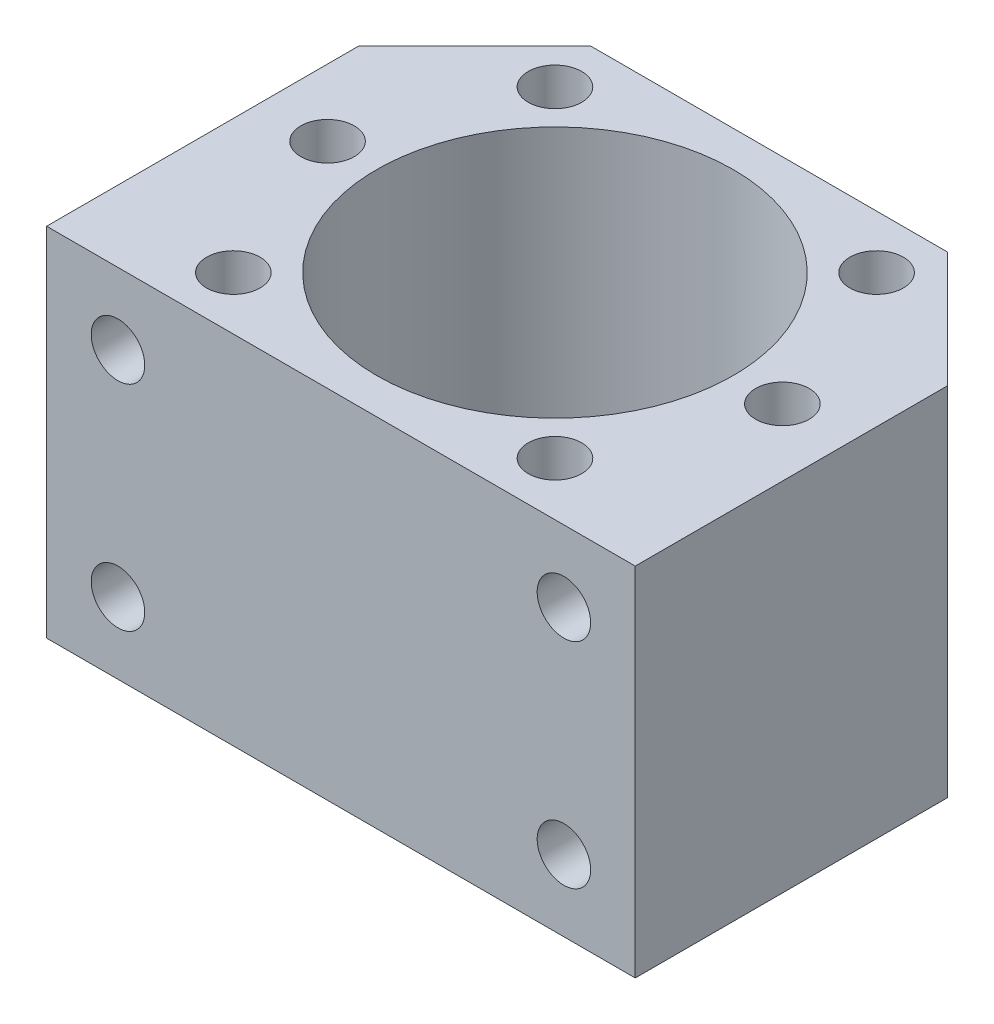
ISO-10303-21;
HEADER;
FILE_DESCRIPTION(('STEP AP214'),'2;1');
FILE_NAME('part.step','',(''),(''),'','','');
FILE_SCHEMA(('AUTOMOTIVE_DESIGN { 1 0 10303 214 1 1 1 1 }'));
ENDSEC;
DATA;
#1=APPLICATION_CONTEXT('core data for automotive mechanical design processes');
#2=APPLICATION_PROTOCOL_DEFINITION('international standard','automotive_design',2000,#1);
#3=PRODUCT_CONTEXT('',#1,'mechanical');
#4=PRODUCT('Part','Part','',(#3));
#5=PRODUCT_RELATED_PRODUCT_CATEGORY('part','',(#4));
#6=PRODUCT_DEFINITION_FORMATION('','',#4);
#7=PRODUCT_DEFINITION_CONTEXT('part definition',#1,'design');
#8=PRODUCT_DEFINITION('design','',#6,#7);
#9=PRODUCT_DEFINITION_SHAPE('','',#8);
#10=(LENGTH_UNIT() NAMED_UNIT(*) SI_UNIT(.MILLI.,.METRE.));
#11=(NAMED_UNIT(*) PLANE_ANGLE_UNIT() SI_UNIT($,.RADIAN.));
#12=(NAMED_UNIT(*) SI_UNIT($,.STERADIAN.) SOLID_ANGLE_UNIT());
#13=UNCERTAINTY_MEASURE_WITH_UNIT(LENGTH_MEASURE(1.E-05),#10,'distance_accuracy_value','');
#14=(GEOMETRIC_REPRESENTATION_CONTEXT(3) GLOBAL_UNCERTAINTY_ASSIGNED_CONTEXT((#13)) GLOBAL_UNIT_ASSIGNED_CONTEXT((#10,
#11,#12)) REPRESENTATION_CONTEXT('',''));
#15=CARTESIAN_POINT('',(0.,0.,0.));
#16=DIRECTION('',(0.,0.,1.));
#17=DIRECTION('',(1.,0.,0.));
#18=AXIS2_PLACEMENT_3D('',#15,#16,#17);
#19=CARTESIAN_POINT('',(0.,40.,0.));
#20=DIRECTION('',(0.,-1.,0.));
#21=DIRECTION('',(0.,0.,-1.));
#22=AXIS2_PLACEMENT_3D('',#19,#20,#21);
#23=PLANE('',#22);
#24=DIRECTION('',(0.,0.,1.));
#25=VECTOR('',#24,1.);
#26=CARTESIAN_POINT('',(-33.,40.,24.));
#27=LINE('',#26,#25);
#28=CARTESIAN_POINT('',(-33.,40.,-11.));
#29=VERTEX_POINT('',#28);
#30=CARTESIAN_POINT('',(-33.,40.,24.));
#31=VERTEX_POINT('',#30);
#32=EDGE_CURVE('E130',#29,#31,#27,.T.);
#33=ORIENTED_EDGE('',*,*,#32,.T.);
#34=DIRECTION('',(1.,0.,0.));
#35=VECTOR('',#34,1.);
#36=CARTESIAN_POINT('',(-33.,40.,24.));
#37=LINE('',#36,#35);
#38=CARTESIAN_POINT('',(33.,40.,24.));
#39=VERTEX_POINT('',#38);
#40=EDGE_CURVE('E88',#31,#39,#37,.T.);
#41=ORIENTED_EDGE('',*,*,#40,.T.);
#42=DIRECTION('',(0.,0.,-1.));
#43=VECTOR('',#42,1.);
#44=CARTESIAN_POINT('',(33.,40.,24.));
#45=LINE('',#44,#43);
#46=CARTESIAN_POINT('',(33.,40.,-11.));
#47=VERTEX_POINT('',#46);
#48=EDGE_CURVE('E101',#39,#47,#45,.T.);
#49=ORIENTED_EDGE('',*,*,#48,.T.);
#50=DIRECTION('',(-0.707106781186548,0.,-0.707106781186547));
#51=VECTOR('',#50,1.);
#52=CARTESIAN_POINT('',(33.,40.,-11.));
#53=LINE('',#52,#51);
#54=CARTESIAN_POINT('',(20.,40.,-24.));
#55=VERTEX_POINT('',#54);
#56=EDGE_CURVE('E95',#47,#55,#53,.T.);
#57=ORIENTED_EDGE('',*,*,#56,.T.);
#58=DIRECTION('',(-1.,0.,0.));
#59=VECTOR('',#58,1.);
#60=CARTESIAN_POINT('',(-20.,40.,-24.));
#61=LINE('',#60,#59);
#62=CARTESIAN_POINT('',(-20.,40.,-24.));
#63=VERTEX_POINT('',#62);
#64=EDGE_CURVE('E99',#55,#63,#61,.T.);
#65=ORIENTED_EDGE('',*,*,#64,.T.);
#66=DIRECTION('',(-0.707106781186547,0.,0.707106781186548));
#67=VECTOR('',#66,1.);
#68=CARTESIAN_POINT('',(-33.,40.,-11.));
#69=LINE('',#68,#67);
#70=EDGE_CURVE('E51',#63,#29,#69,.T.);
#71=ORIENTED_EDGE('',*,*,#70,.T.);
#72=EDGE_LOOP('',(#33,#41,#49,#57,#65,#71));
#73=FACE_BOUND('',#72,.T.);
#74=CARTESIAN_POINT('',(0.,40.,0.));
#75=DIRECTION('',(0.,1.,0.));
#76=DIRECTION('',(0.,0.,1.));
#77=AXIS2_PLACEMENT_3D('',#74,#75,#76);
#78=CIRCLE('',#77,20.);
#79=CARTESIAN_POINT('',(0.,40.,20.));
#80=VERTEX_POINT('',#79);
#81=EDGE_CURVE('E123',#80,#80,#78,.T.);
#82=ORIENTED_EDGE('',*,*,#81,.F.);
#83=EDGE_LOOP('',(#82));
#84=FACE_BOUND('',#83,.T.);
#85=CARTESIAN_POINT('',(-25.5,40.,0.));
#86=DIRECTION('',(0.,1.,0.));
#87=DIRECTION('',(0.,0.,1.));
#88=AXIS2_PLACEMENT_3D('',#85,#86,#87);
#89=CIRCLE('',#88,3.);
#90=CARTESIAN_POINT('',(-25.5,40.,3.));
#91=VERTEX_POINT('',#90);
#92=EDGE_CURVE('E277',#91,#91,#89,.T.);
#93=ORIENTED_EDGE('',*,*,#92,.F.);
#94=EDGE_LOOP('',(#93));
#95=FACE_BOUND('',#94,.T.);
#96=CARTESIAN_POINT('',(-18.0312229202571,40.,-18.0312229202569));
#97=DIRECTION('',(0.,1.,0.));
#98=DIRECTION('',(0.,0.,1.));
#99=AXIS2_PLACEMENT_3D('',#96,#97,#98);
#100=CIRCLE('',#99,3.);
#101=CARTESIAN_POINT('',(-18.0312229202571,40.,-15.0312229202569));
#102=VERTEX_POINT('',#101);
#103=EDGE_CURVE('E271',#102,#102,#100,.T.);
#104=ORIENTED_EDGE('',*,*,#103,.F.);
#105=EDGE_LOOP('',(#104));
#106=FACE_BOUND('',#105,.T.);
#107=CARTESIAN_POINT('',(-18.0312229202571,40.,18.0312229202569));
#108=DIRECTION('',(0.,1.,0.));
#109=DIRECTION('',(0.,0.,1.));
#110=AXIS2_PLACEMENT_3D('',#107,#108,#109);
#111=CIRCLE('',#110,3.);
#112=CARTESIAN_POINT('',(-18.0312229202571,40.,21.0312229202569));
#113=VERTEX_POINT('',#112);
#114=EDGE_CURVE('E265',#113,#113,#111,.T.);
#115=ORIENTED_EDGE('',*,*,#114,.F.);
#116=EDGE_LOOP('',(#115));
#117=FACE_BOUND('',#116,.T.);
#118=CARTESIAN_POINT('',(18.0312229202571,40.,18.0312229202568));
#119=DIRECTION('',(0.,1.,0.));
#120=DIRECTION('',(0.,0.,-1.));
#121=AXIS2_PLACEMENT_3D('',#118,#119,#120);
#122=CIRCLE('',#121,3.);
#123=CARTESIAN_POINT('',(18.0312229202571,40.,15.0312229202568));
#124=VERTEX_POINT('',#123);
#125=EDGE_CURVE('E259',#124,#124,#122,.T.);
#126=ORIENTED_EDGE('',*,*,#125,.F.);
#127=EDGE_LOOP('',(#126));
#128=FACE_BOUND('',#127,.T.);
#129=CARTESIAN_POINT('',(18.0312229202571,40.,-18.0312229202569));
#130=DIRECTION('',(0.,1.,0.));
#131=DIRECTION('',(0.,0.,-1.));
#132=AXIS2_PLACEMENT_3D('',#129,#130,#131);
#133=CIRCLE('',#132,3.);
#134=CARTESIAN_POINT('',(18.0312229202571,40.,-21.0312229202569));
#135=VERTEX_POINT('',#134);
#136=EDGE_CURVE('E253',#135,#135,#133,.T.);
#137=ORIENTED_EDGE('',*,*,#136,.F.);
#138=EDGE_LOOP('',(#137));
#139=FACE_BOUND('',#138,.T.);
#140=CARTESIAN_POINT('',(25.5,40.,0.));
#141=DIRECTION('',(0.,1.,0.));
#142=DIRECTION('',(0.,0.,-1.));
#143=AXIS2_PLACEMENT_3D('',#140,#141,#142);
#144=CIRCLE('',#143,3.);
#145=CARTESIAN_POINT('',(25.5,40.,-3.00000000000003));
#146=VERTEX_POINT('',#145);
#147=EDGE_CURVE('E247',#146,#146,#144,.T.);
#148=ORIENTED_EDGE('',*,*,#147,.F.);
#149=EDGE_LOOP('',(#148));
#150=FACE_BOUND('',#149,.T.);
#151=ADVANCED_FACE('F34',(#73,#84,#95,#106,#117,#128,#139,#150),#23,.F.);
#152=CARTESIAN_POINT('',(0.,0.,0.));
#153=DIRECTION('',(0.,-1.,0.));
#154=DIRECTION('',(0.,0.,-1.));
#155=AXIS2_PLACEMENT_3D('',#152,#153,#154);
#156=PLANE('',#155);
#157=CARTESIAN_POINT('',(18.0312229202571,0.,-18.0312229202569));
#158=DIRECTION('',(0.,1.,0.));
#159=DIRECTION('',(0.,0.,-1.));
#160=AXIS2_PLACEMENT_3D('',#157,#158,#159);
#161=CIRCLE('',#160,3.);
#162=CARTESIAN_POINT('',(18.0312229202571,0.,-21.0312229202569));
#163=VERTEX_POINT('',#162);
#164=EDGE_CURVE('E250',#163,#163,#161,.T.);
#165=ORIENTED_EDGE('',*,*,#164,.T.);
#166=EDGE_LOOP('',(#165));
#167=FACE_BOUND('',#166,.T.);
#168=CARTESIAN_POINT('',(-18.0312229202571,0.,18.0312229202569));
#169=DIRECTION('',(0.,1.,0.));
#170=DIRECTION('',(0.,0.,1.));
#171=AXIS2_PLACEMENT_3D('',#168,#169,#170);
#172=CIRCLE('',#171,3.);
#173=CARTESIAN_POINT('',(-18.0312229202571,0.,21.0312229202569));
#174=VERTEX_POINT('',#173);
#175=EDGE_CURVE('E262',#174,#174,#172,.T.);
#176=ORIENTED_EDGE('',*,*,#175,.T.);
#177=EDGE_LOOP('',(#176));
#178=FACE_BOUND('',#177,.T.);
#179=CARTESIAN_POINT('',(-25.5,0.,0.));
#180=DIRECTION('',(0.,1.,0.));
#181=DIRECTION('',(0.,0.,1.));
#182=AXIS2_PLACEMENT_3D('',#179,#180,#181);
#183=CIRCLE('',#182,3.);
#184=CARTESIAN_POINT('',(-25.5,0.,3.));
#185=VERTEX_POINT('',#184);
#186=EDGE_CURVE('E274',#185,#185,#183,.T.);
#187=ORIENTED_EDGE('',*,*,#186,.T.);
#188=EDGE_LOOP('',(#187));
#189=FACE_BOUND('',#188,.T.);
#190=DIRECTION('',(0.,0.,1.));
#191=VECTOR('',#190,1.);
#192=CARTESIAN_POINT('',(-33.,0.,24.));
#193=LINE('',#192,#191);
#194=CARTESIAN_POINT('',(-33.,0.,-11.));
#195=VERTEX_POINT('',#194);
#196=CARTESIAN_POINT('',(-33.,0.,24.));
#197=VERTEX_POINT('',#196);
#198=EDGE_CURVE('E119',#195,#197,#193,.T.);
#199=ORIENTED_EDGE('',*,*,#198,.F.);
#200=DIRECTION('',(-0.707106781186547,0.,0.707106781186548));
#201=VECTOR('',#200,1.);
#202=CARTESIAN_POINT('',(-33.,0.,-11.));
#203=LINE('',#202,#201);
#204=CARTESIAN_POINT('',(-20.,0.,-24.));
#205=VERTEX_POINT('',#204);
#206=EDGE_CURVE('E80',#205,#195,#203,.T.);
#207=ORIENTED_EDGE('',*,*,#206,.F.);
#208=DIRECTION('',(-1.,0.,0.));
#209=VECTOR('',#208,1.);
#210=CARTESIAN_POINT('',(-20.,0.,-24.));
#211=LINE('',#210,#209);
#212=CARTESIAN_POINT('',(20.,0.,-24.));
#213=VERTEX_POINT('',#212);
#214=EDGE_CURVE('E74',#213,#205,#211,.T.);
#215=ORIENTED_EDGE('',*,*,#214,.F.);
#216=DIRECTION('',(-0.707106781186548,0.,-0.707106781186547));
#217=VECTOR('',#216,1.);
#218=CARTESIAN_POINT('',(33.,0.,-11.));
#219=LINE('',#218,#217);
#220=CARTESIAN_POINT('',(33.,0.,-11.));
#221=VERTEX_POINT('',#220);
#222=EDGE_CURVE('E109',#221,#213,#219,.T.);
#223=ORIENTED_EDGE('',*,*,#222,.F.);
#224=DIRECTION('',(0.,0.,-1.));
#225=VECTOR('',#224,1.);
#226=CARTESIAN_POINT('',(33.,0.,24.));
#227=LINE('',#226,#225);
#228=CARTESIAN_POINT('',(33.,0.,24.));
#229=VERTEX_POINT('',#228);
#230=EDGE_CURVE('E125',#229,#221,#227,.T.);
#231=ORIENTED_EDGE('',*,*,#230,.F.);
#232=DIRECTION('',(1.,0.,0.));
#233=VECTOR('',#232,1.);
#234=CARTESIAN_POINT('',(-33.,0.,24.));
#235=LINE('',#234,#233);
#236=EDGE_CURVE('E122',#197,#229,#235,.T.);
#237=ORIENTED_EDGE('',*,*,#236,.F.);
#238=EDGE_LOOP('',(#199,#207,#215,#223,#231,#237));
#239=FACE_BOUND('',#238,.T.);
#240=CARTESIAN_POINT('',(0.,0.,0.));
#241=DIRECTION('',(0.,1.,0.));
#242=DIRECTION('',(0.,0.,1.));
#243=AXIS2_PLACEMENT_3D('',#240,#241,#242);
#244=CIRCLE('',#243,20.);
#245=CARTESIAN_POINT('',(0.,0.,20.));
#246=VERTEX_POINT('',#245);
#247=EDGE_CURVE('E280',#246,#246,#244,.T.);
#248=ORIENTED_EDGE('',*,*,#247,.T.);
#249=EDGE_LOOP('',(#248));
#250=FACE_BOUND('',#249,.T.);
#251=CARTESIAN_POINT('',(-18.0312229202571,0.,-18.0312229202569));
#252=DIRECTION('',(0.,1.,0.));
#253=DIRECTION('',(0.,0.,1.));
#254=AXIS2_PLACEMENT_3D('',#251,#252,#253);
#255=CIRCLE('',#254,3.);
#256=CARTESIAN_POINT('',(-18.0312229202571,0.,-15.0312229202569));
#257=VERTEX_POINT('',#256);
#258=EDGE_CURVE('E268',#257,#257,#255,.T.);
#259=ORIENTED_EDGE('',*,*,#258,.T.);
#260=EDGE_LOOP('',(#259));
#261=FACE_BOUND('',#260,.T.);
#262=CARTESIAN_POINT('',(18.0312229202571,0.,18.0312229202568));
#263=DIRECTION('',(0.,1.,0.));
#264=DIRECTION('',(0.,0.,-1.));
#265=AXIS2_PLACEMENT_3D('',#262,#263,#264);
#266=CIRCLE('',#265,3.);
#267=CARTESIAN_POINT('',(18.0312229202571,0.,15.0312229202568));
#268=VERTEX_POINT('',#267);
#269=EDGE_CURVE('E256',#268,#268,#266,.T.);
#270=ORIENTED_EDGE('',*,*,#269,.T.);
#271=EDGE_LOOP('',(#270));
#272=FACE_BOUND('',#271,.T.);
#273=CARTESIAN_POINT('',(25.5,0.,0.));
#274=DIRECTION('',(0.,1.,0.));
#275=DIRECTION('',(0.,0.,-1.));
#276=AXIS2_PLACEMENT_3D('',#273,#274,#275);
#277=CIRCLE('',#276,3.);
#278=CARTESIAN_POINT('',(25.5,0.,-3.00000000000003));
#279=VERTEX_POINT('',#278);
#280=EDGE_CURVE('E245',#279,#279,#277,.T.);
#281=ORIENTED_EDGE('',*,*,#280,.T.);
#282=EDGE_LOOP('',(#281));
#283=FACE_BOUND('',#282,.T.);
#284=ADVANCED_FACE('F139',(#167,#178,#189,#239,#250,#261,#272,#283),#156,.T.);
#285=CARTESIAN_POINT('',(-33.,40.,24.));
#286=DIRECTION('',(1.,0.,0.));
#287=DIRECTION('',(0.,0.,-1.));
#288=AXIS2_PLACEMENT_3D('',#285,#286,#287);
#289=PLANE('',#288);
#290=ORIENTED_EDGE('',*,*,#198,.T.);
#291=DIRECTION('',(0.,-1.,0.));
#292=VECTOR('',#291,1.);
#293=CARTESIAN_POINT('',(-33.,40.,24.));
#294=LINE('',#293,#292);
#295=EDGE_CURVE('E11',#31,#197,#294,.T.);
#296=ORIENTED_EDGE('',*,*,#295,.F.);
#297=ORIENTED_EDGE('',*,*,#32,.F.);
#298=DIRECTION('',(0.,-1.,0.));
#299=VECTOR('',#298,1.);
#300=CARTESIAN_POINT('',(-33.,40.,-11.));
#301=LINE('',#300,#299);
#302=EDGE_CURVE('E115',#29,#195,#301,.T.);
#303=ORIENTED_EDGE('',*,*,#302,.T.);
#304=EDGE_LOOP('',(#290,#296,#297,#303));
#305=FACE_BOUND('',#304,.T.);
#306=ADVANCED_FACE('F36',(#305),#289,.F.);
#307=CARTESIAN_POINT('',(-33.,40.,24.));
#308=DIRECTION('',(0.,0.,-1.));
#309=DIRECTION('',(-1.,0.,0.));
#310=AXIS2_PLACEMENT_3D('',#307,#308,#309);
#311=PLANE('',#310);
#312=CARTESIAN_POINT('',(25.,32.,24.));
#313=DIRECTION('',(0.,0.,1.));
#314=DIRECTION('',(-1.,0.,0.));
#315=AXIS2_PLACEMENT_3D('',#312,#313,#314);
#316=CIRCLE('',#315,3.);
#317=CARTESIAN_POINT('',(22.,32.,24.));
#318=VERTEX_POINT('',#317);
#319=EDGE_CURVE('E241',#318,#318,#316,.T.);
#320=ORIENTED_EDGE('',*,*,#319,.F.);
#321=EDGE_LOOP('',(#320));
#322=FACE_BOUND('',#321,.T.);
#323=CARTESIAN_POINT('',(25.,8.,24.));
#324=DIRECTION('',(0.,0.,1.));
#325=DIRECTION('',(-1.,0.,0.));
#326=AXIS2_PLACEMENT_3D('',#323,#324,#325);
#327=CIRCLE('',#326,3.);
#328=CARTESIAN_POINT('',(22.,8.,24.));
#329=VERTEX_POINT('',#328);
#330=EDGE_CURVE('E235',#329,#329,#327,.T.);
#331=ORIENTED_EDGE('',*,*,#330,.F.);
#332=EDGE_LOOP('',(#331));
#333=FACE_BOUND('',#332,.T.);
#334=CARTESIAN_POINT('',(-25.,8.,24.));
#335=DIRECTION('',(0.,0.,1.));
#336=DIRECTION('',(1.,0.,0.));
#337=AXIS2_PLACEMENT_3D('',#334,#335,#336);
#338=CIRCLE('',#337,3.);
#339=CARTESIAN_POINT('',(-22.,8.,24.));
#340=VERTEX_POINT('',#339);
#341=EDGE_CURVE('E224',#340,#340,#338,.T.);
#342=ORIENTED_EDGE('',*,*,#341,.F.);
#343=EDGE_LOOP('',(#342));
#344=FACE_BOUND('',#343,.T.);
#345=CARTESIAN_POINT('',(-25.,32.,24.));
#346=DIRECTION('',(0.,0.,1.));
#347=DIRECTION('',(1.,0.,0.));
#348=AXIS2_PLACEMENT_3D('',#345,#346,#347);
#349=CIRCLE('',#348,3.);
#350=CARTESIAN_POINT('',(-22.,32.,24.));
#351=VERTEX_POINT('',#350);
#352=EDGE_CURVE('E223',#351,#351,#349,.T.);
#353=ORIENTED_EDGE('',*,*,#352,.F.);
#354=EDGE_LOOP('',(#353));
#355=FACE_BOUND('',#354,.T.);
#356=ORIENTED_EDGE('',*,*,#236,.T.);
#357=DIRECTION('',(0.,-1.,0.));
#358=VECTOR('',#357,1.);
#359=CARTESIAN_POINT('',(33.,40.,24.));
#360=LINE('',#359,#358);
#361=EDGE_CURVE('E43',#39,#229,#360,.T.);
#362=ORIENTED_EDGE('',*,*,#361,.F.);
#363=ORIENTED_EDGE('',*,*,#40,.F.);
#364=ORIENTED_EDGE('',*,*,#295,.T.);
#365=EDGE_LOOP('',(#356,#362,#363,#364));
#366=FACE_BOUND('',#365,.T.);
#367=ADVANCED_FACE('F324',(#322,#333,#344,#355,#366),#311,.F.);
#368=CARTESIAN_POINT('',(33.,40.,24.));
#369=DIRECTION('',(-1.,0.,0.));
#370=DIRECTION('',(0.,0.,1.));
#371=AXIS2_PLACEMENT_3D('',#368,#369,#370);
#372=PLANE('',#371);
#373=ORIENTED_EDGE('',*,*,#230,.T.);
#374=DIRECTION('',(0.,-1.,0.));
#375=VECTOR('',#374,1.);
#376=CARTESIAN_POINT('',(33.,40.,-11.));
#377=LINE('',#376,#375);
#378=EDGE_CURVE('E110',#47,#221,#377,.T.);
#379=ORIENTED_EDGE('',*,*,#378,.F.);
#380=ORIENTED_EDGE('',*,*,#48,.F.);
#381=ORIENTED_EDGE('',*,*,#361,.T.);
#382=EDGE_LOOP('',(#373,#379,#380,#381));
#383=FACE_BOUND('',#382,.T.);
#384=ADVANCED_FACE('F136',(#383),#372,.F.);
#385=CARTESIAN_POINT('',(33.,40.,-11.));
#386=DIRECTION('',(-0.707106781186547,0.,0.707106781186548));
#387=DIRECTION('',(0.707106781186548,0.,0.707106781186547));
#388=AXIS2_PLACEMENT_3D('',#385,#386,#387);
#389=PLANE('',#388);
#390=ORIENTED_EDGE('',*,*,#222,.T.);
#391=DIRECTION('',(0.,-1.,0.));
#392=VECTOR('',#391,1.);
#393=CARTESIAN_POINT('',(20.,40.,-24.));
#394=LINE('',#393,#392);
#395=EDGE_CURVE('E106',#55,#213,#394,.T.);
#396=ORIENTED_EDGE('',*,*,#395,.F.);
#397=ORIENTED_EDGE('',*,*,#56,.F.);
#398=ORIENTED_EDGE('',*,*,#378,.T.);
#399=EDGE_LOOP('',(#390,#396,#397,#398));
#400=FACE_BOUND('',#399,.T.);
#401=ADVANCED_FACE('F107',(#400),#389,.F.);
#402=CARTESIAN_POINT('',(-20.,40.,-24.));
#403=DIRECTION('',(0.,0.,1.));
#404=DIRECTION('',(1.,0.,0.));
#405=AXIS2_PLACEMENT_3D('',#402,#403,#404);
#406=PLANE('',#405);
#407=ORIENTED_EDGE('',*,*,#214,.T.);
#408=DIRECTION('',(0.,-1.,0.));
#409=VECTOR('',#408,1.);
#410=CARTESIAN_POINT('',(-20.,40.,-24.));
#411=LINE('',#410,#409);
#412=EDGE_CURVE('E111',#63,#205,#411,.T.);
#413=ORIENTED_EDGE('',*,*,#412,.F.);
#414=ORIENTED_EDGE('',*,*,#64,.F.);
#415=ORIENTED_EDGE('',*,*,#395,.T.);
#416=EDGE_LOOP('',(#407,#413,#414,#415));
#417=FACE_BOUND('',#416,.T.);
#418=ADVANCED_FACE('F113',(#417),#406,.F.);
#419=CARTESIAN_POINT('',(-33.,40.,-11.));
#420=DIRECTION('',(0.707106781186548,0.,0.707106781186547));
#421=DIRECTION('',(0.707106781186547,0.,-0.707106781186548));
#422=AXIS2_PLACEMENT_3D('',#419,#420,#421);
#423=PLANE('',#422);
#424=ORIENTED_EDGE('',*,*,#206,.T.);
#425=ORIENTED_EDGE('',*,*,#302,.F.);
#426=ORIENTED_EDGE('',*,*,#70,.F.);
#427=ORIENTED_EDGE('',*,*,#412,.T.);
#428=EDGE_LOOP('',(#424,#425,#426,#427));
#429=FACE_BOUND('',#428,.T.);
#430=ADVANCED_FACE('F144',(#429),#423,.F.);
#431=CARTESIAN_POINT('',(0.,40.,0.));
#432=DIRECTION('',(0.,-1.,0.));
#433=DIRECTION('',(0.,0.,-1.));
#434=AXIS2_PLACEMENT_3D('',#431,#432,#433);
#435=CYLINDRICAL_SURFACE('',#434,20.);
#436=ORIENTED_EDGE('',*,*,#81,.T.);
#437=EDGE_LOOP('',(#436));
#438=FACE_BOUND('',#437,.T.);
#439=ORIENTED_EDGE('',*,*,#247,.F.);
#440=EDGE_LOOP('',(#439));
#441=FACE_BOUND('',#440,.T.);
#442=ADVANCED_FACE('F146',(#438,#441),#435,.F.);
#443=CARTESIAN_POINT('',(-25.5,40.,0.));
#444=DIRECTION('',(0.,-1.,0.));
#445=DIRECTION('',(0.,0.,-1.));
#446=AXIS2_PLACEMENT_3D('',#443,#444,#445);
#447=CYLINDRICAL_SURFACE('',#446,3.);
#448=ORIENTED_EDGE('',*,*,#92,.T.);
#449=EDGE_LOOP('',(#448));
#450=FACE_BOUND('',#449,.T.);
#451=ORIENTED_EDGE('',*,*,#186,.F.);
#452=EDGE_LOOP('',(#451));
#453=FACE_BOUND('',#452,.T.);
#454=ADVANCED_FACE('F152',(#450,#453),#447,.F.);
#455=CARTESIAN_POINT('',(-18.0312229202571,40.,-18.0312229202569));
#456=DIRECTION('',(0.,-1.,0.));
#457=DIRECTION('',(0.,0.,-1.));
#458=AXIS2_PLACEMENT_3D('',#455,#456,#457);
#459=CYLINDRICAL_SURFACE('',#458,3.);
#460=ORIENTED_EDGE('',*,*,#103,.T.);
#461=EDGE_LOOP('',(#460));
#462=FACE_BOUND('',#461,.T.);
#463=ORIENTED_EDGE('',*,*,#258,.F.);
#464=EDGE_LOOP('',(#463));
#465=FACE_BOUND('',#464,.T.);
#466=ADVANCED_FACE('F166',(#462,#465),#459,.F.);
#467=CARTESIAN_POINT('',(-18.0312229202571,40.,18.0312229202569));
#468=DIRECTION('',(0.,-1.,0.));
#469=DIRECTION('',(0.,0.,-1.));
#470=AXIS2_PLACEMENT_3D('',#467,#468,#469);
#471=CYLINDRICAL_SURFACE('',#470,3.);
#472=ORIENTED_EDGE('',*,*,#114,.T.);
#473=EDGE_LOOP('',(#472));
#474=FACE_BOUND('',#473,.T.);
#475=ORIENTED_EDGE('',*,*,#175,.F.);
#476=EDGE_LOOP('',(#475));
#477=FACE_BOUND('',#476,.T.);
#478=ADVANCED_FACE('F170',(#474,#477),#471,.F.);
#479=CARTESIAN_POINT('',(18.0312229202571,40.,18.0312229202568));
#480=DIRECTION('',(0.,-1.,0.));
#481=DIRECTION('',(0.,0.,-1.));
#482=AXIS2_PLACEMENT_3D('',#479,#480,#481);
#483=CYLINDRICAL_SURFACE('',#482,3.);
#484=ORIENTED_EDGE('',*,*,#125,.T.);
#485=EDGE_LOOP('',(#484));
#486=FACE_BOUND('',#485,.T.);
#487=ORIENTED_EDGE('',*,*,#269,.F.);
#488=EDGE_LOOP('',(#487));
#489=FACE_BOUND('',#488,.T.);
#490=ADVANCED_FACE('F174',(#486,#489),#483,.F.);
#491=CARTESIAN_POINT('',(18.0312229202571,40.,-18.0312229202569));
#492=DIRECTION('',(0.,-1.,0.));
#493=DIRECTION('',(0.,0.,-1.));
#494=AXIS2_PLACEMENT_3D('',#491,#492,#493);
#495=CYLINDRICAL_SURFACE('',#494,3.);
#496=ORIENTED_EDGE('',*,*,#136,.T.);
#497=EDGE_LOOP('',(#496));
#498=FACE_BOUND('',#497,.T.);
#499=ORIENTED_EDGE('',*,*,#164,.F.);
#500=EDGE_LOOP('',(#499));
#501=FACE_BOUND('',#500,.T.);
#502=ADVANCED_FACE('F178',(#498,#501),#495,.F.);
#503=CARTESIAN_POINT('',(25.5,40.,0.));
#504=DIRECTION('',(0.,-1.,0.));
#505=DIRECTION('',(0.,0.,-1.));
#506=AXIS2_PLACEMENT_3D('',#503,#504,#505);
#507=CYLINDRICAL_SURFACE('',#506,3.);
#508=ORIENTED_EDGE('',*,*,#147,.T.);
#509=EDGE_LOOP('',(#508));
#510=FACE_BOUND('',#509,.T.);
#511=ORIENTED_EDGE('',*,*,#280,.F.);
#512=EDGE_LOOP('',(#511));
#513=FACE_BOUND('',#512,.T.);
#514=ADVANCED_FACE('F182',(#510,#513),#507,.F.);
#515=CARTESIAN_POINT('',(-25.,32.,9.));
#516=DIRECTION('',(0.,0.,1.));
#517=DIRECTION('',(1.,0.,0.));
#518=AXIS2_PLACEMENT_3D('',#515,#516,#517);
#519=CYLINDRICAL_SURFACE('',#518,3.);
#520=CARTESIAN_POINT('',(-25.,32.,9.));
#521=DIRECTION('',(0.,0.,1.));
#522=DIRECTION('',(1.,0.,0.));
#523=AXIS2_PLACEMENT_3D('',#520,#521,#522);
#524=CIRCLE('',#523,3.);
#525=CARTESIAN_POINT('',(-22.,32.,9.));
#526=VERTEX_POINT('',#525);
#527=EDGE_CURVE('E227',#526,#526,#524,.T.);
#528=ORIENTED_EDGE('',*,*,#527,.F.);
#529=EDGE_LOOP('',(#528));
#530=FACE_BOUND('',#529,.T.);
#531=ORIENTED_EDGE('',*,*,#352,.T.);
#532=EDGE_LOOP('',(#531));
#533=FACE_BOUND('',#532,.T.);
#534=ADVANCED_FACE('F186',(#530,#533),#519,.F.);
#535=CARTESIAN_POINT('',(-25.,32.,9.));
#536=DIRECTION('',(0.,0.,1.));
#537=DIRECTION('',(1.,0.,0.));
#538=AXIS2_PLACEMENT_3D('',#535,#536,#537);
#539=PLANE('',#538);
#540=ORIENTED_EDGE('',*,*,#527,.T.);
#541=EDGE_LOOP('',(#540));
#542=FACE_BOUND('',#541,.T.);
#543=ADVANCED_FACE('F190',(#542),#539,.T.);
#544=CARTESIAN_POINT('',(-25.,8.,9.));
#545=DIRECTION('',(0.,0.,1.));
#546=DIRECTION('',(1.,0.,0.));
#547=AXIS2_PLACEMENT_3D('',#544,#545,#546);
#548=CYLINDRICAL_SURFACE('',#547,3.);
#549=CARTESIAN_POINT('',(-25.,8.,9.));
#550=DIRECTION('',(0.,0.,1.));
#551=DIRECTION('',(1.,0.,0.));
#552=AXIS2_PLACEMENT_3D('',#549,#550,#551);
#553=CIRCLE('',#552,3.);
#554=CARTESIAN_POINT('',(-22.,8.,9.));
#555=VERTEX_POINT('',#554);
#556=EDGE_CURVE('E222',#555,#555,#553,.T.);
#557=ORIENTED_EDGE('',*,*,#556,.F.);
#558=EDGE_LOOP('',(#557));
#559=FACE_BOUND('',#558,.T.);
#560=ORIENTED_EDGE('',*,*,#341,.T.);
#561=EDGE_LOOP('',(#560));
#562=FACE_BOUND('',#561,.T.);
#563=ADVANCED_FACE('F194',(#559,#562),#548,.F.);
#564=CARTESIAN_POINT('',(-25.,8.,9.));
#565=DIRECTION('',(0.,0.,1.));
#566=DIRECTION('',(1.,0.,0.));
#567=AXIS2_PLACEMENT_3D('',#564,#565,#566);
#568=PLANE('',#567);
#569=ORIENTED_EDGE('',*,*,#556,.T.);
#570=EDGE_LOOP('',(#569));
#571=FACE_BOUND('',#570,.T.);
#572=ADVANCED_FACE('F208',(#571),#568,.T.);
#573=CARTESIAN_POINT('',(25.,8.,9.));
#574=DIRECTION('',(0.,0.,1.));
#575=DIRECTION('',(1.,0.,0.));
#576=AXIS2_PLACEMENT_3D('',#573,#574,#575);
#577=CYLINDRICAL_SURFACE('',#576,3.);
#578=CARTESIAN_POINT('',(25.,8.,9.));
#579=DIRECTION('',(0.,0.,1.));
#580=DIRECTION('',(-1.,0.,0.));
#581=AXIS2_PLACEMENT_3D('',#578,#579,#580);
#582=CIRCLE('',#581,3.);
#583=CARTESIAN_POINT('',(22.,8.,9.));
#584=VERTEX_POINT('',#583);
#585=EDGE_CURVE('E230',#584,#584,#582,.T.);
#586=ORIENTED_EDGE('',*,*,#585,.F.);
#587=EDGE_LOOP('',(#586));
#588=FACE_BOUND('',#587,.T.);
#589=ORIENTED_EDGE('',*,*,#330,.T.);
#590=EDGE_LOOP('',(#589));
#591=FACE_BOUND('',#590,.T.);
#592=ADVANCED_FACE('F205',(#588,#591),#577,.F.);
#593=CARTESIAN_POINT('',(25.,8.,9.));
#594=DIRECTION('',(0.,0.,-1.));
#595=DIRECTION('',(-1.,0.,0.));
#596=AXIS2_PLACEMENT_3D('',#593,#594,#595);
#597=PLANE('',#596);
#598=ORIENTED_EDGE('',*,*,#585,.T.);
#599=EDGE_LOOP('',(#598));
#600=FACE_BOUND('',#599,.T.);
#601=ADVANCED_FACE('F200',(#600),#597,.F.);
#602=CARTESIAN_POINT('',(25.,32.,9.));
#603=DIRECTION('',(0.,0.,1.));
#604=DIRECTION('',(1.,0.,0.));
#605=AXIS2_PLACEMENT_3D('',#602,#603,#604);
#606=CYLINDRICAL_SURFACE('',#605,3.);
#607=CARTESIAN_POINT('',(25.,32.,9.));
#608=DIRECTION('',(0.,0.,1.));
#609=DIRECTION('',(-1.,0.,0.));
#610=AXIS2_PLACEMENT_3D('',#607,#608,#609);
#611=CIRCLE('',#610,3.);
#612=CARTESIAN_POINT('',(22.,32.,9.));
#613=VERTEX_POINT('',#612);
#614=EDGE_CURVE('E238',#613,#613,#611,.T.);
#615=ORIENTED_EDGE('',*,*,#614,.F.);
#616=EDGE_LOOP('',(#615));
#617=FACE_BOUND('',#616,.T.);
#618=ORIENTED_EDGE('',*,*,#319,.T.);
#619=EDGE_LOOP('',(#618));
#620=FACE_BOUND('',#619,.T.);
#621=ADVANCED_FACE('F196',(#617,#620),#606,.F.);
#622=CARTESIAN_POINT('',(25.,32.,9.));
#623=DIRECTION('',(0.,0.,-1.));
#624=DIRECTION('',(-1.,0.,0.));
#625=AXIS2_PLACEMENT_3D('',#622,#623,#624);
#626=PLANE('',#625);
#627=ORIENTED_EDGE('',*,*,#614,.T.);
#628=EDGE_LOOP('',(#627));
#629=FACE_BOUND('',#628,.T.);
#630=ADVANCED_FACE('F199',(#629),#626,.F.);
#631=CLOSED_SHELL('',(#151,#284,#306,#367,#384,#401,#418,#430,#442,#454,#466,#478,#490,#502,
#514,#534,#543,#563,#572,#592,#601,#621,#630));
#632=MANIFOLD_SOLID_BREP('B2',#631);
#633=ADVANCED_BREP_SHAPE_REPRESENTATION('',(#18,#632),#14);
#634=SHAPE_DEFINITION_REPRESENTATION(#9,#633);
ENDSEC;
END-ISO-10303-21;
